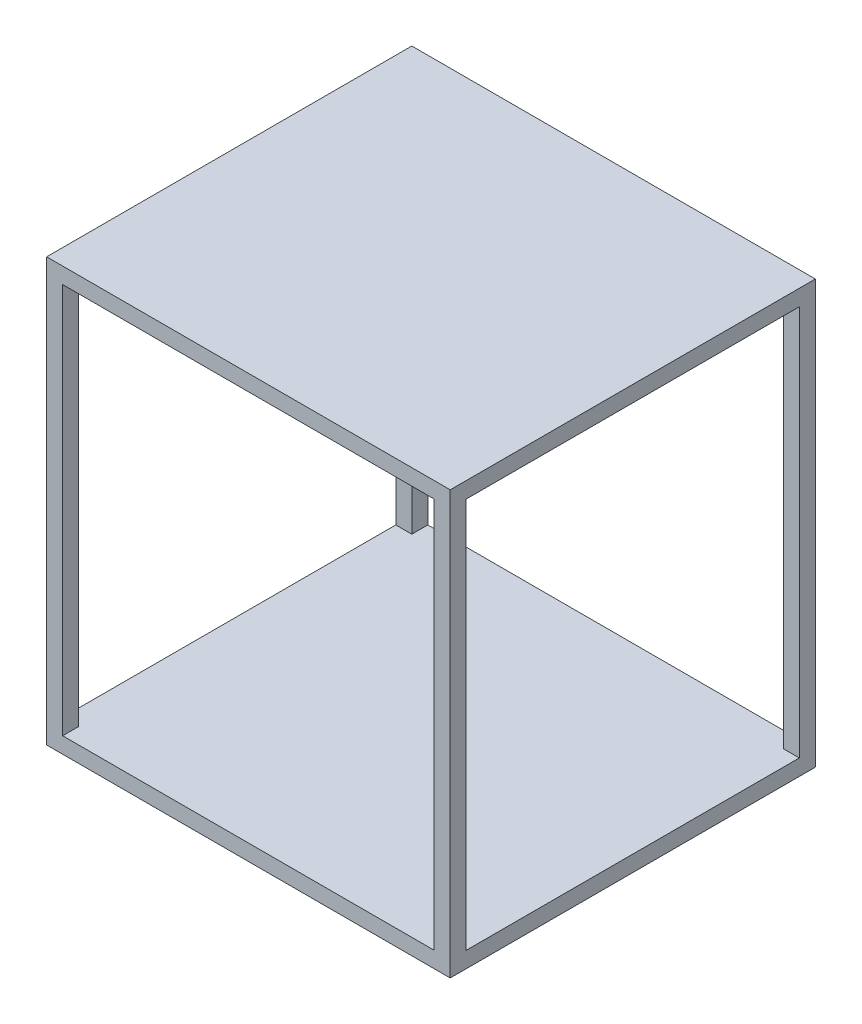
ISO-10303-21;
HEADER;
FILE_DESCRIPTION(('STEP AP214'),'2;1');
FILE_NAME('part.step','',(''),(''),'','','');
FILE_SCHEMA(('AUTOMOTIVE_DESIGN { 1 0 10303 214 1 1 1 1 }'));
ENDSEC;
DATA;
#1=APPLICATION_CONTEXT('core data for automotive mechanical design processes');
#2=APPLICATION_PROTOCOL_DEFINITION('international standard','automotive_design',2000,#1);
#3=PRODUCT_CONTEXT('',#1,'mechanical');
#4=PRODUCT('Part','Part','',(#3));
#5=PRODUCT_RELATED_PRODUCT_CATEGORY('part','',(#4));
#6=PRODUCT_DEFINITION_FORMATION('','',#4);
#7=PRODUCT_DEFINITION_CONTEXT('part definition',#1,'design');
#8=PRODUCT_DEFINITION('design','',#6,#7);
#9=PRODUCT_DEFINITION_SHAPE('','',#8);
#10=(LENGTH_UNIT() NAMED_UNIT(*) SI_UNIT(.MILLI.,.METRE.));
#11=(NAMED_UNIT(*) PLANE_ANGLE_UNIT() SI_UNIT($,.RADIAN.));
#12=(NAMED_UNIT(*) SI_UNIT($,.STERADIAN.) SOLID_ANGLE_UNIT());
#13=UNCERTAINTY_MEASURE_WITH_UNIT(LENGTH_MEASURE(1.E-05),#10,'distance_accuracy_value','');
#14=(GEOMETRIC_REPRESENTATION_CONTEXT(3) GLOBAL_UNCERTAINTY_ASSIGNED_CONTEXT((#13)) GLOBAL_UNIT_ASSIGNED_CONTEXT((#10,
#11,#12)) REPRESENTATION_CONTEXT('',''));
#15=CARTESIAN_POINT('',(0.,0.,0.));
#16=DIRECTION('',(0.,0.,1.));
#17=DIRECTION('',(1.,0.,0.));
#18=AXIS2_PLACEMENT_3D('',#15,#16,#17);
#19=CARTESIAN_POINT('',(-290.,635.,-285.));
#20=DIRECTION('',(-1.,0.,0.));
#21=DIRECTION('',(0.,0.,1.));
#22=AXIS2_PLACEMENT_3D('',#19,#20,#21);
#23=PLANE('',#22);
#24=DIRECTION('',(0.,0.,1.));
#25=VECTOR('',#24,1.);
#26=CARTESIAN_POINT('',(-290.,635.,-285.));
#27=LINE('',#26,#25);
#28=CARTESIAN_POINT('',(-290.,635.,-285.));
#29=VERTEX_POINT('',#28);
#30=CARTESIAN_POINT('',(-290.,635.,-260.));
#31=VERTEX_POINT('',#30);
#32=EDGE_CURVE('E244',#29,#31,#27,.T.);
#33=ORIENTED_EDGE('',*,*,#32,.T.);
#34=DIRECTION('',(0.,-1.,0.));
#35=VECTOR('',#34,1.);
#36=CARTESIAN_POINT('',(-290.,635.,-260.));
#37=LINE('',#36,#35);
#38=CARTESIAN_POINT('',(-290.,25.,-260.));
#39=VERTEX_POINT('',#38);
#40=EDGE_CURVE('E211',#31,#39,#37,.T.);
#41=ORIENTED_EDGE('',*,*,#40,.T.);
#42=DIRECTION('',(0.,0.,1.));
#43=VECTOR('',#42,1.);
#44=CARTESIAN_POINT('',(-290.,25.,-285.));
#45=LINE('',#44,#43);
#46=CARTESIAN_POINT('',(-290.,25.,-285.));
#47=VERTEX_POINT('',#46);
#48=EDGE_CURVE('E259',#47,#39,#45,.T.);
#49=ORIENTED_EDGE('',*,*,#48,.F.);
#50=DIRECTION('',(0.,-1.,0.));
#51=VECTOR('',#50,1.);
#52=CARTESIAN_POINT('',(-290.,635.,-285.));
#53=LINE('',#52,#51);
#54=EDGE_CURVE('E227',#29,#47,#53,.T.);
#55=ORIENTED_EDGE('',*,*,#54,.F.);
#56=EDGE_LOOP('',(#33,#41,#49,#55));
#57=FACE_BOUND('',#56,.T.);
#58=ADVANCED_FACE('F41',(#57),#23,.F.);
#59=CARTESIAN_POINT('',(290.,635.,-285.));
#60=DIRECTION('',(1.,0.,0.));
#61=DIRECTION('',(0.,1.,0.));
#62=AXIS2_PLACEMENT_3D('',#59,#60,#61);
#63=PLANE('',#62);
#64=DIRECTION('',(0.,0.,1.));
#65=VECTOR('',#64,1.);
#66=CARTESIAN_POINT('',(290.,25.,-285.));
#67=LINE('',#66,#65);
#68=CARTESIAN_POINT('',(290.,25.,-285.));
#69=VERTEX_POINT('',#68);
#70=CARTESIAN_POINT('',(290.,25.,-260.));
#71=VERTEX_POINT('',#70);
#72=EDGE_CURVE('E255',#69,#71,#67,.T.);
#73=ORIENTED_EDGE('',*,*,#72,.T.);
#74=DIRECTION('',(0.,1.,0.));
#75=VECTOR('',#74,1.);
#76=CARTESIAN_POINT('',(290.,635.,-260.));
#77=LINE('',#76,#75);
#78=CARTESIAN_POINT('',(290.,635.,-260.));
#79=VERTEX_POINT('',#78);
#80=EDGE_CURVE('E162',#71,#79,#77,.T.);
#81=ORIENTED_EDGE('',*,*,#80,.T.);
#82=DIRECTION('',(0.,0.,1.));
#83=VECTOR('',#82,1.);
#84=CARTESIAN_POINT('',(290.,635.,-285.));
#85=LINE('',#84,#83);
#86=CARTESIAN_POINT('',(290.,635.,-285.));
#87=VERTEX_POINT('',#86);
#88=EDGE_CURVE('E250',#87,#79,#85,.T.);
#89=ORIENTED_EDGE('',*,*,#88,.F.);
#90=DIRECTION('',(0.,1.,0.));
#91=VECTOR('',#90,1.);
#92=CARTESIAN_POINT('',(290.,635.,-285.));
#93=LINE('',#92,#91);
#94=EDGE_CURVE('E235',#69,#87,#93,.T.);
#95=ORIENTED_EDGE('',*,*,#94,.F.);
#96=EDGE_LOOP('',(#73,#81,#89,#95));
#97=FACE_BOUND('',#96,.T.);
#98=ADVANCED_FACE('F356',(#97),#63,.F.);
#99=CARTESIAN_POINT('',(315.,660.,-285.));
#100=DIRECTION('',(-1.,0.,0.));
#101=DIRECTION('',(0.,0.,1.));
#102=AXIS2_PLACEMENT_3D('',#99,#100,#101);
#103=PLANE('',#102);
#104=DIRECTION('',(0.,0.,-1.));
#105=VECTOR('',#104,1.);
#106=CARTESIAN_POINT('',(315.,635.,-260.));
#107=LINE('',#106,#105);
#108=CARTESIAN_POINT('',(315.,635.,260.));
#109=VERTEX_POINT('',#108);
#110=CARTESIAN_POINT('',(315.,635.,-260.));
#111=VERTEX_POINT('',#110);
#112=EDGE_CURVE('E178',#109,#111,#107,.T.);
#113=ORIENTED_EDGE('',*,*,#112,.T.);
#114=DIRECTION('',(0.,-1.,0.));
#115=VECTOR('',#114,1.);
#116=CARTESIAN_POINT('',(315.,635.,-260.));
#117=LINE('',#116,#115);
#118=CARTESIAN_POINT('',(315.,25.,-260.));
#119=VERTEX_POINT('',#118);
#120=EDGE_CURVE('E159',#111,#119,#117,.T.);
#121=ORIENTED_EDGE('',*,*,#120,.T.);
#122=DIRECTION('',(0.,0.,1.));
#123=VECTOR('',#122,1.);
#124=CARTESIAN_POINT('',(315.,25.,-260.));
#125=LINE('',#124,#123);
#126=CARTESIAN_POINT('',(315.,25.,260.));
#127=VERTEX_POINT('',#126);
#128=EDGE_CURVE('E169',#119,#127,#125,.T.);
#129=ORIENTED_EDGE('',*,*,#128,.T.);
#130=DIRECTION('',(0.,1.,0.));
#131=VECTOR('',#130,1.);
#132=CARTESIAN_POINT('',(315.,635.,260.));
#133=LINE('',#132,#131);
#134=EDGE_CURVE('E57',#127,#109,#133,.T.);
#135=ORIENTED_EDGE('',*,*,#134,.T.);
#136=EDGE_LOOP('',(#113,#121,#129,#135));
#137=FACE_BOUND('',#136,.T.);
#138=DIRECTION('',(0.,0.,-1.));
#139=VECTOR('',#138,1.);
#140=CARTESIAN_POINT('',(315.,0.,-285.));
#141=LINE('',#140,#139);
#142=CARTESIAN_POINT('',(315.,0.,285.));
#143=VERTEX_POINT('',#142);
#144=CARTESIAN_POINT('',(315.,0.,-285.));
#145=VERTEX_POINT('',#144);
#146=EDGE_CURVE('E248',#143,#145,#141,.T.);
#147=ORIENTED_EDGE('',*,*,#146,.T.);
#148=DIRECTION('',(0.,-1.,0.));
#149=VECTOR('',#148,1.);
#150=CARTESIAN_POINT('',(315.,660.,-285.));
#151=LINE('',#150,#149);
#152=CARTESIAN_POINT('',(315.,660.,-285.));
#153=VERTEX_POINT('',#152);
#154=EDGE_CURVE('E299',#153,#145,#151,.T.);
#155=ORIENTED_EDGE('',*,*,#154,.F.);
#156=DIRECTION('',(0.,0.,-1.));
#157=VECTOR('',#156,1.);
#158=CARTESIAN_POINT('',(315.,660.,-285.));
#159=LINE('',#158,#157);
#160=CARTESIAN_POINT('',(315.,660.,285.));
#161=VERTEX_POINT('',#160);
#162=EDGE_CURVE('E262',#161,#153,#159,.T.);
#163=ORIENTED_EDGE('',*,*,#162,.F.);
#164=DIRECTION('',(0.,-1.,0.));
#165=VECTOR('',#164,1.);
#166=CARTESIAN_POINT('',(315.,660.,285.));
#167=LINE('',#166,#165);
#168=EDGE_CURVE('E276',#161,#143,#167,.T.);
#169=ORIENTED_EDGE('',*,*,#168,.T.);
#170=EDGE_LOOP('',(#147,#155,#163,#169));
#171=FACE_BOUND('',#170,.T.);
#172=ADVANCED_FACE('F43',(#137,#171),#103,.F.);
#173=CARTESIAN_POINT('',(-315.,660.,-285.));
#174=DIRECTION('',(0.,0.,1.));
#175=DIRECTION('',(1.,0.,0.));
#176=AXIS2_PLACEMENT_3D('',#173,#174,#175);
#177=PLANE('',#176);
#178=DIRECTION('',(-1.,0.,0.));
#179=VECTOR('',#178,1.);
#180=CARTESIAN_POINT('',(-290.,635.,-285.));
#181=LINE('',#180,#179);
#182=EDGE_CURVE('E239',#87,#29,#181,.T.);
#183=ORIENTED_EDGE('',*,*,#182,.T.);
#184=ORIENTED_EDGE('',*,*,#54,.T.);
#185=DIRECTION('',(1.,0.,0.));
#186=VECTOR('',#185,1.);
#187=CARTESIAN_POINT('',(-290.,25.,-285.));
#188=LINE('',#187,#186);
#189=EDGE_CURVE('E231',#47,#69,#188,.T.);
#190=ORIENTED_EDGE('',*,*,#189,.T.);
#191=ORIENTED_EDGE('',*,*,#94,.T.);
#192=EDGE_LOOP('',(#183,#184,#190,#191));
#193=FACE_BOUND('',#192,.T.);
#194=DIRECTION('',(-1.,0.,0.));
#195=VECTOR('',#194,1.);
#196=CARTESIAN_POINT('',(-315.,0.,-285.));
#197=LINE('',#196,#195);
#198=CARTESIAN_POINT('',(-315.,0.,-285.));
#199=VERTEX_POINT('',#198);
#200=EDGE_CURVE('E280',#145,#199,#197,.T.);
#201=ORIENTED_EDGE('',*,*,#200,.T.);
#202=DIRECTION('',(0.,-1.,0.));
#203=VECTOR('',#202,1.);
#204=CARTESIAN_POINT('',(-315.,660.,-285.));
#205=LINE('',#204,#203);
#206=CARTESIAN_POINT('',(-315.,660.,-285.));
#207=VERTEX_POINT('',#206);
#208=EDGE_CURVE('E295',#207,#199,#205,.T.);
#209=ORIENTED_EDGE('',*,*,#208,.F.);
#210=DIRECTION('',(-1.,0.,0.));
#211=VECTOR('',#210,1.);
#212=CARTESIAN_POINT('',(-315.,660.,-285.));
#213=LINE('',#212,#211);
#214=EDGE_CURVE('E266',#153,#207,#213,.T.);
#215=ORIENTED_EDGE('',*,*,#214,.F.);
#216=ORIENTED_EDGE('',*,*,#154,.T.);
#217=EDGE_LOOP('',(#201,#209,#215,#216));
#218=FACE_BOUND('',#217,.T.);
#219=ADVANCED_FACE('F352',(#193,#218),#177,.F.);
#220=CARTESIAN_POINT('',(-315.,660.,-285.));
#221=DIRECTION('',(1.,0.,0.));
#222=DIRECTION('',(0.,0.,-1.));
#223=AXIS2_PLACEMENT_3D('',#220,#221,#222);
#224=PLANE('',#223);
#225=DIRECTION('',(0.,0.,-1.));
#226=VECTOR('',#225,1.);
#227=CARTESIAN_POINT('',(-315.,25.,-285.));
#228=LINE('',#227,#226);
#229=CARTESIAN_POINT('',(-315.,25.,260.));
#230=VERTEX_POINT('',#229);
#231=CARTESIAN_POINT('',(-315.,25.,-260.));
#232=VERTEX_POINT('',#231);
#233=EDGE_CURVE('E219',#230,#232,#228,.T.);
#234=ORIENTED_EDGE('',*,*,#233,.T.);
#235=DIRECTION('',(0.,1.,0.));
#236=VECTOR('',#235,1.);
#237=CARTESIAN_POINT('',(-315.,660.,-260.));
#238=LINE('',#237,#236);
#239=CARTESIAN_POINT('',(-315.,635.,-260.));
#240=VERTEX_POINT('',#239);
#241=EDGE_CURVE('E215',#232,#240,#238,.T.);
#242=ORIENTED_EDGE('',*,*,#241,.T.);
#243=DIRECTION('',(0.,0.,1.));
#244=VECTOR('',#243,1.);
#245=CARTESIAN_POINT('',(-315.,635.,-285.));
#246=LINE('',#245,#244);
#247=CARTESIAN_POINT('',(-315.,635.,260.));
#248=VERTEX_POINT('',#247);
#249=EDGE_CURVE('E223',#240,#248,#246,.T.);
#250=ORIENTED_EDGE('',*,*,#249,.T.);
#251=DIRECTION('',(0.,-1.,0.));
#252=VECTOR('',#251,1.);
#253=CARTESIAN_POINT('',(-315.,660.,260.));
#254=LINE('',#253,#252);
#255=EDGE_CURVE('E205',#248,#230,#254,.T.);
#256=ORIENTED_EDGE('',*,*,#255,.T.);
#257=EDGE_LOOP('',(#234,#242,#250,#256));
#258=FACE_BOUND('',#257,.T.);
#259=DIRECTION('',(0.,0.,1.));
#260=VECTOR('',#259,1.);
#261=CARTESIAN_POINT('',(-315.,0.,-285.));
#262=LINE('',#261,#260);
#263=CARTESIAN_POINT('',(-315.,0.,285.));
#264=VERTEX_POINT('',#263);
#265=EDGE_CURVE('E283',#199,#264,#262,.T.);
#266=ORIENTED_EDGE('',*,*,#265,.T.);
#267=DIRECTION('',(0.,-1.,0.));
#268=VECTOR('',#267,1.);
#269=CARTESIAN_POINT('',(-315.,660.,285.));
#270=LINE('',#269,#268);
#271=CARTESIAN_POINT('',(-315.,660.,285.));
#272=VERTEX_POINT('',#271);
#273=EDGE_CURVE('E291',#272,#264,#270,.T.);
#274=ORIENTED_EDGE('',*,*,#273,.F.);
#275=DIRECTION('',(0.,0.,1.));
#276=VECTOR('',#275,1.);
#277=CARTESIAN_POINT('',(-315.,660.,-285.));
#278=LINE('',#277,#276);
#279=EDGE_CURVE('E270',#207,#272,#278,.T.);
#280=ORIENTED_EDGE('',*,*,#279,.F.);
#281=ORIENTED_EDGE('',*,*,#208,.T.);
#282=EDGE_LOOP('',(#266,#274,#280,#281));
#283=FACE_BOUND('',#282,.T.);
#284=ADVANCED_FACE('F343',(#258,#283),#224,.F.);
#285=CARTESIAN_POINT('',(-315.,660.,285.));
#286=DIRECTION('',(0.,0.,-1.));
#287=DIRECTION('',(-1.,0.,0.));
#288=AXIS2_PLACEMENT_3D('',#285,#286,#287);
#289=PLANE('',#288);
#290=DIRECTION('',(-1.,0.,0.));
#291=VECTOR('',#290,1.);
#292=CARTESIAN_POINT('',(-315.,25.,285.));
#293=LINE('',#292,#291);
#294=CARTESIAN_POINT('',(290.,25.,285.));
#295=VERTEX_POINT('',#294);
#296=CARTESIAN_POINT('',(-290.,25.,285.));
#297=VERTEX_POINT('',#296);
#298=EDGE_CURVE('E303',#295,#297,#293,.T.);
#299=ORIENTED_EDGE('',*,*,#298,.T.);
#300=DIRECTION('',(0.,1.,0.));
#301=VECTOR('',#300,1.);
#302=CARTESIAN_POINT('',(-290.,660.,285.));
#303=LINE('',#302,#301);
#304=CARTESIAN_POINT('',(-290.,635.,285.));
#305=VERTEX_POINT('',#304);
#306=EDGE_CURVE('E11',#297,#305,#303,.T.);
#307=ORIENTED_EDGE('',*,*,#306,.T.);
#308=DIRECTION('',(1.,0.,0.));
#309=VECTOR('',#308,1.);
#310=CARTESIAN_POINT('',(-315.,635.,285.));
#311=LINE('',#310,#309);
#312=CARTESIAN_POINT('',(290.,635.,285.));
#313=VERTEX_POINT('',#312);
#314=EDGE_CURVE('E50',#305,#313,#311,.T.);
#315=ORIENTED_EDGE('',*,*,#314,.T.);
#316=DIRECTION('',(0.,-1.,0.));
#317=VECTOR('',#316,1.);
#318=CARTESIAN_POINT('',(290.,660.,285.));
#319=LINE('',#318,#317);
#320=EDGE_CURVE('E307',#313,#295,#319,.T.);
#321=ORIENTED_EDGE('',*,*,#320,.T.);
#322=EDGE_LOOP('',(#299,#307,#315,#321));
#323=FACE_BOUND('',#322,.T.);
#324=DIRECTION('',(1.,0.,0.));
#325=VECTOR('',#324,1.);
#326=CARTESIAN_POINT('',(-315.,0.,285.));
#327=LINE('',#326,#325);
#328=EDGE_CURVE('E267',#264,#143,#327,.T.);
#329=ORIENTED_EDGE('',*,*,#328,.T.);
#330=ORIENTED_EDGE('',*,*,#168,.F.);
#331=DIRECTION('',(1.,0.,0.));
#332=VECTOR('',#331,1.);
#333=CARTESIAN_POINT('',(-315.,660.,285.));
#334=LINE('',#333,#332);
#335=EDGE_CURVE('E273',#272,#161,#334,.T.);
#336=ORIENTED_EDGE('',*,*,#335,.F.);
#337=ORIENTED_EDGE('',*,*,#273,.T.);
#338=EDGE_LOOP('',(#329,#330,#336,#337));
#339=FACE_BOUND('',#338,.T.);
#340=ADVANCED_FACE('F314',(#323,#339),#289,.F.);
#341=CARTESIAN_POINT('',(0.,660.,0.));
#342=DIRECTION('',(0.,1.,0.));
#343=DIRECTION('',(0.,0.,1.));
#344=AXIS2_PLACEMENT_3D('',#341,#342,#343);
#345=PLANE('',#344);
#346=ORIENTED_EDGE('',*,*,#162,.T.);
#347=ORIENTED_EDGE('',*,*,#214,.T.);
#348=ORIENTED_EDGE('',*,*,#279,.T.);
#349=ORIENTED_EDGE('',*,*,#335,.T.);
#350=EDGE_LOOP('',(#346,#347,#348,#349));
#351=FACE_BOUND('',#350,.T.);
#352=ADVANCED_FACE('F461',(#351),#345,.T.);
#353=CARTESIAN_POINT('',(0.,0.,0.));
#354=DIRECTION('',(0.,1.,0.));
#355=DIRECTION('',(0.,0.,1.));
#356=AXIS2_PLACEMENT_3D('',#353,#354,#355);
#357=PLANE('',#356);
#358=ORIENTED_EDGE('',*,*,#146,.F.);
#359=ORIENTED_EDGE('',*,*,#328,.F.);
#360=ORIENTED_EDGE('',*,*,#265,.F.);
#361=ORIENTED_EDGE('',*,*,#200,.F.);
#362=EDGE_LOOP('',(#358,#359,#360,#361));
#363=FACE_BOUND('',#362,.T.);
#364=ADVANCED_FACE('F375',(#363),#357,.F.);
#365=CARTESIAN_POINT('',(-290.,25.,260.));
#366=VERTEX_POINT('',#365);
#367=EDGE_CURVE('E243',#366,#297,#45,.T.);
#368=ORIENTED_EDGE('',*,*,#367,.F.);
#369=DIRECTION('',(0.,1.,0.));
#370=VECTOR('',#369,1.);
#371=CARTESIAN_POINT('',(-290.,635.,260.));
#372=LINE('',#371,#370);
#373=CARTESIAN_POINT('',(-290.,635.,260.));
#374=VERTEX_POINT('',#373);
#375=EDGE_CURVE('E201',#366,#374,#372,.T.);
#376=ORIENTED_EDGE('',*,*,#375,.T.);
#377=EDGE_CURVE('E249',#374,#305,#27,.T.);
#378=ORIENTED_EDGE('',*,*,#377,.T.);
#379=ORIENTED_EDGE('',*,*,#306,.F.);
#380=EDGE_LOOP('',(#368,#376,#378,#379));
#381=FACE_BOUND('',#380,.T.);
#382=ADVANCED_FACE('F333',(#381),#23,.F.);
#383=CARTESIAN_POINT('',(-290.,635.,-285.));
#384=DIRECTION('',(0.,1.,0.));
#385=DIRECTION('',(0.,0.,1.));
#386=AXIS2_PLACEMENT_3D('',#383,#384,#385);
#387=PLANE('',#386);
#388=ORIENTED_EDGE('',*,*,#377,.F.);
#389=DIRECTION('',(-1.,0.,0.));
#390=VECTOR('',#389,1.);
#391=CARTESIAN_POINT('',(315.,635.,260.));
#392=LINE('',#391,#390);
#393=EDGE_CURVE('E195',#374,#248,#392,.T.);
#394=ORIENTED_EDGE('',*,*,#393,.T.);
#395=ORIENTED_EDGE('',*,*,#249,.F.);
#396=DIRECTION('',(-1.,0.,0.));
#397=VECTOR('',#396,1.);
#398=CARTESIAN_POINT('',(315.,635.,-260.));
#399=LINE('',#398,#397);
#400=EDGE_CURVE('E190',#31,#240,#399,.T.);
#401=ORIENTED_EDGE('',*,*,#400,.F.);
#402=ORIENTED_EDGE('',*,*,#32,.F.);
#403=ORIENTED_EDGE('',*,*,#182,.F.);
#404=ORIENTED_EDGE('',*,*,#88,.T.);
#405=EDGE_CURVE('E186',#111,#79,#399,.T.);
#406=ORIENTED_EDGE('',*,*,#405,.F.);
#407=ORIENTED_EDGE('',*,*,#112,.F.);
#408=CARTESIAN_POINT('',(290.,635.,260.));
#409=VERTEX_POINT('',#408);
#410=EDGE_CURVE('E191',#109,#409,#392,.T.);
#411=ORIENTED_EDGE('',*,*,#410,.T.);
#412=EDGE_CURVE('E254',#409,#313,#85,.T.);
#413=ORIENTED_EDGE('',*,*,#412,.T.);
#414=ORIENTED_EDGE('',*,*,#314,.F.);
#415=EDGE_LOOP('',(#388,#394,#395,#401,#402,#403,#404,#406,#407,#411,#413,#414));
#416=FACE_BOUND('',#415,.T.);
#417=ADVANCED_FACE('F320',(#416),#387,.F.);
#418=ORIENTED_EDGE('',*,*,#412,.F.);
#419=DIRECTION('',(0.,-1.,0.));
#420=VECTOR('',#419,1.);
#421=CARTESIAN_POINT('',(290.,635.,260.));
#422=LINE('',#421,#420);
#423=CARTESIAN_POINT('',(290.,25.,260.));
#424=VERTEX_POINT('',#423);
#425=EDGE_CURVE('E189',#409,#424,#422,.T.);
#426=ORIENTED_EDGE('',*,*,#425,.T.);
#427=EDGE_CURVE('E258',#424,#295,#67,.T.);
#428=ORIENTED_EDGE('',*,*,#427,.T.);
#429=ORIENTED_EDGE('',*,*,#320,.F.);
#430=EDGE_LOOP('',(#418,#426,#428,#429));
#431=FACE_BOUND('',#430,.T.);
#432=ADVANCED_FACE('F325',(#431),#63,.F.);
#433=CARTESIAN_POINT('',(-290.,25.,-285.));
#434=DIRECTION('',(0.,-1.,0.));
#435=DIRECTION('',(1.,0.,0.));
#436=AXIS2_PLACEMENT_3D('',#433,#434,#435);
#437=PLANE('',#436);
#438=ORIENTED_EDGE('',*,*,#427,.F.);
#439=DIRECTION('',(-1.,0.,0.));
#440=VECTOR('',#439,1.);
#441=CARTESIAN_POINT('',(315.,25.,260.));
#442=LINE('',#441,#440);
#443=EDGE_CURVE('E172',#127,#424,#442,.T.);
#444=ORIENTED_EDGE('',*,*,#443,.F.);
#445=ORIENTED_EDGE('',*,*,#128,.F.);
#446=DIRECTION('',(-1.,0.,0.));
#447=VECTOR('',#446,1.);
#448=CARTESIAN_POINT('',(315.,25.,-260.));
#449=LINE('',#448,#447);
#450=EDGE_CURVE('E155',#119,#71,#449,.T.);
#451=ORIENTED_EDGE('',*,*,#450,.T.);
#452=ORIENTED_EDGE('',*,*,#72,.F.);
#453=ORIENTED_EDGE('',*,*,#189,.F.);
#454=ORIENTED_EDGE('',*,*,#48,.T.);
#455=EDGE_CURVE('E65',#39,#232,#449,.T.);
#456=ORIENTED_EDGE('',*,*,#455,.T.);
#457=ORIENTED_EDGE('',*,*,#233,.F.);
#458=EDGE_CURVE('E166',#366,#230,#442,.T.);
#459=ORIENTED_EDGE('',*,*,#458,.F.);
#460=ORIENTED_EDGE('',*,*,#367,.T.);
#461=ORIENTED_EDGE('',*,*,#298,.F.);
#462=EDGE_LOOP('',(#438,#444,#445,#451,#452,#453,#454,#456,#457,#459,#460,#461));
#463=FACE_BOUND('',#462,.T.);
#464=ADVANCED_FACE('F171',(#463),#437,.F.);
#465=CARTESIAN_POINT('',(315.,635.,260.));
#466=DIRECTION('',(0.,0.,1.));
#467=DIRECTION('',(1.,0.,0.));
#468=AXIS2_PLACEMENT_3D('',#465,#466,#467);
#469=PLANE('',#468);
#470=ORIENTED_EDGE('',*,*,#410,.F.);
#471=ORIENTED_EDGE('',*,*,#134,.F.);
#472=ORIENTED_EDGE('',*,*,#443,.T.);
#473=ORIENTED_EDGE('',*,*,#425,.F.);
#474=EDGE_LOOP('',(#470,#471,#472,#473));
#475=FACE_BOUND('',#474,.T.);
#476=ADVANCED_FACE('F371',(#475),#469,.F.);
#477=CARTESIAN_POINT('',(315.,635.,-260.));
#478=DIRECTION('',(0.,0.,-1.));
#479=DIRECTION('',(-1.,0.,0.));
#480=AXIS2_PLACEMENT_3D('',#477,#478,#479);
#481=PLANE('',#480);
#482=ORIENTED_EDGE('',*,*,#450,.F.);
#483=ORIENTED_EDGE('',*,*,#120,.F.);
#484=ORIENTED_EDGE('',*,*,#405,.T.);
#485=ORIENTED_EDGE('',*,*,#80,.F.);
#486=EDGE_LOOP('',(#482,#483,#484,#485));
#487=FACE_BOUND('',#486,.T.);
#488=ADVANCED_FACE('F157',(#487),#481,.F.);
#489=ORIENTED_EDGE('',*,*,#455,.F.);
#490=ORIENTED_EDGE('',*,*,#40,.F.);
#491=ORIENTED_EDGE('',*,*,#400,.T.);
#492=ORIENTED_EDGE('',*,*,#241,.F.);
#493=EDGE_LOOP('',(#489,#490,#491,#492));
#494=FACE_BOUND('',#493,.T.);
#495=ADVANCED_FACE('F347',(#494),#481,.F.);
#496=ORIENTED_EDGE('',*,*,#393,.F.);
#497=ORIENTED_EDGE('',*,*,#375,.F.);
#498=ORIENTED_EDGE('',*,*,#458,.T.);
#499=ORIENTED_EDGE('',*,*,#255,.F.);
#500=EDGE_LOOP('',(#496,#497,#498,#499));
#501=FACE_BOUND('',#500,.T.);
#502=ADVANCED_FACE('F341',(#501),#469,.F.);
#503=CLOSED_SHELL('',(#58,#98,#172,#219,#284,#340,#352,#364,#382,#417,#432,#464,#476,#488,#495,#502));
#504=MANIFOLD_SOLID_BREP('B2',#503);
#505=ADVANCED_BREP_SHAPE_REPRESENTATION('',(#18,#504),#14);
#506=SHAPE_DEFINITION_REPRESENTATION(#9,#505);
ENDSEC;
END-ISO-10303-21;
